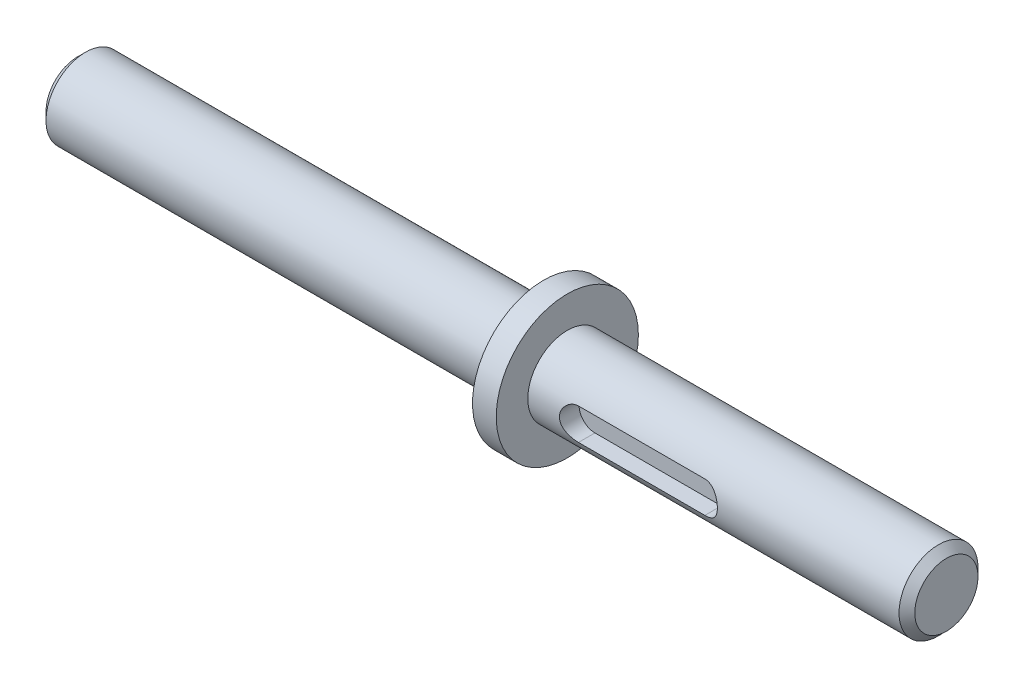
ISO-10303-21;
HEADER;
FILE_DESCRIPTION(('STEP AP214'),'2;1');
FILE_NAME('part.step','',(''),(''),'','','');
FILE_SCHEMA(('AUTOMOTIVE_DESIGN { 1 0 10303 214 1 1 1 1 }'));
ENDSEC;
DATA;
#1=APPLICATION_CONTEXT('core data for automotive mechanical design processes');
#2=APPLICATION_PROTOCOL_DEFINITION('international standard','automotive_design',2000,#1);
#3=PRODUCT_CONTEXT('',#1,'mechanical');
#4=PRODUCT('Part','Part','',(#3));
#5=PRODUCT_RELATED_PRODUCT_CATEGORY('part','',(#4));
#6=PRODUCT_DEFINITION_FORMATION('','',#4);
#7=PRODUCT_DEFINITION_CONTEXT('part definition',#1,'design');
#8=PRODUCT_DEFINITION('design','',#6,#7);
#9=PRODUCT_DEFINITION_SHAPE('','',#8);
#10=(LENGTH_UNIT() NAMED_UNIT(*) SI_UNIT(.MILLI.,.METRE.));
#11=(NAMED_UNIT(*) PLANE_ANGLE_UNIT() SI_UNIT($,.RADIAN.));
#12=(NAMED_UNIT(*) SI_UNIT($,.STERADIAN.) SOLID_ANGLE_UNIT());
#13=UNCERTAINTY_MEASURE_WITH_UNIT(LENGTH_MEASURE(1.E-05),#10,'distance_accuracy_value','');
#14=(GEOMETRIC_REPRESENTATION_CONTEXT(3) GLOBAL_UNCERTAINTY_ASSIGNED_CONTEXT((#13)) GLOBAL_UNIT_ASSIGNED_CONTEXT((#10,
#11,#12)) REPRESENTATION_CONTEXT('',''));
#15=CARTESIAN_POINT('',(0.,0.,0.));
#16=DIRECTION('',(0.,0.,1.));
#17=DIRECTION('',(1.,0.,0.));
#18=AXIS2_PLACEMENT_3D('',#15,#16,#17);
#19=CARTESIAN_POINT('',(-59.,0.,0.));
#20=DIRECTION('',(1.,0.,0.));
#21=DIRECTION('',(0.,0.,-1.));
#22=AXIS2_PLACEMENT_3D('',#19,#20,#21);
#23=PLANE('',#22);
#24=CARTESIAN_POINT('',(-59.,0.,0.));
#25=DIRECTION('',(1.,0.,0.));
#26=DIRECTION('',(0.,0.,-1.));
#27=AXIS2_PLACEMENT_3D('',#24,#25,#26);
#28=CIRCLE('',#27,4.);
#29=CARTESIAN_POINT('',(-59.,0.,-4.));
#30=VERTEX_POINT('',#29);
#31=EDGE_CURVE('E174',#30,#30,#28,.F.);
#32=ORIENTED_EDGE('',*,*,#31,.T.);
#33=EDGE_LOOP('',(#32));
#34=FACE_BOUND('',#33,.T.);
#35=ADVANCED_FACE('F32',(#34),#23,.F.);
#36=CARTESIAN_POINT('',(0.,0.,0.));
#37=DIRECTION('',(1.,0.,0.));
#38=DIRECTION('',(0.,0.,-1.));
#39=AXIS2_PLACEMENT_3D('',#36,#37,#38);
#40=CYLINDRICAL_SURFACE('',#39,5.);
#41=CARTESIAN_POINT('',(-58.,0.,0.));
#42=DIRECTION('',(1.,0.,0.));
#43=DIRECTION('',(0.,0.,-1.));
#44=AXIS2_PLACEMENT_3D('',#41,#42,#43);
#45=CIRCLE('',#44,5.);
#46=CARTESIAN_POINT('',(-58.,0.,-5.));
#47=VERTEX_POINT('',#46);
#48=EDGE_CURVE('E177',#47,#47,#45,.T.);
#49=ORIENTED_EDGE('',*,*,#48,.T.);
#50=EDGE_LOOP('',(#49));
#51=FACE_BOUND('',#50,.T.);
#52=CARTESIAN_POINT('',(0.,0.,0.));
#53=DIRECTION('',(1.,0.,0.));
#54=DIRECTION('',(0.,0.,-1.));
#55=AXIS2_PLACEMENT_3D('',#52,#53,#54);
#56=CIRCLE('',#55,5.);
#57=CARTESIAN_POINT('',(0.,0.,-5.));
#58=VERTEX_POINT('',#57);
#59=EDGE_CURVE('E112',#58,#58,#56,.T.);
#60=ORIENTED_EDGE('',*,*,#59,.F.);
#61=EDGE_LOOP('',(#60));
#62=FACE_BOUND('',#61,.T.);
#63=ADVANCED_FACE('F153',(#51,#62),#40,.T.);
#64=CARTESIAN_POINT('',(0.,0.,5.));
#65=DIRECTION('',(1.,0.,0.));
#66=DIRECTION('',(0.,0.,-1.));
#67=AXIS2_PLACEMENT_3D('',#64,#65,#66);
#68=PLANE('',#67);
#69=CARTESIAN_POINT('',(0.,0.,0.));
#70=DIRECTION('',(1.,0.,0.));
#71=DIRECTION('',(0.,0.,-1.));
#72=AXIS2_PLACEMENT_3D('',#69,#70,#71);
#73=CIRCLE('',#72,9.);
#74=CARTESIAN_POINT('',(0.,0.,-9.));
#75=VERTEX_POINT('',#74);
#76=EDGE_CURVE('E109',#75,#75,#73,.T.);
#77=ORIENTED_EDGE('',*,*,#76,.F.);
#78=EDGE_LOOP('',(#77));
#79=FACE_BOUND('',#78,.T.);
#80=ORIENTED_EDGE('',*,*,#59,.T.);
#81=EDGE_LOOP('',(#80));
#82=FACE_BOUND('',#81,.T.);
#83=ADVANCED_FACE('F159',(#79,#82),#68,.F.);
#84=CARTESIAN_POINT('',(0.,0.,0.));
#85=DIRECTION('',(1.,0.,0.));
#86=DIRECTION('',(0.,0.,-1.));
#87=AXIS2_PLACEMENT_3D('',#84,#85,#86);
#88=CYLINDRICAL_SURFACE('',#87,9.);
#89=CARTESIAN_POINT('',(3.,0.,0.));
#90=DIRECTION('',(1.,0.,0.));
#91=DIRECTION('',(0.,0.,-1.));
#92=AXIS2_PLACEMENT_3D('',#89,#90,#91);
#93=CIRCLE('',#92,9.);
#94=CARTESIAN_POINT('',(3.,0.,-9.));
#95=VERTEX_POINT('',#94);
#96=EDGE_CURVE('E106',#95,#95,#93,.T.);
#97=ORIENTED_EDGE('',*,*,#96,.F.);
#98=EDGE_LOOP('',(#97));
#99=FACE_BOUND('',#98,.T.);
#100=ORIENTED_EDGE('',*,*,#76,.T.);
#101=EDGE_LOOP('',(#100));
#102=FACE_BOUND('',#101,.T.);
#103=ADVANCED_FACE('F254',(#99,#102),#88,.T.);
#104=CARTESIAN_POINT('',(3.,0.,9.));
#105=DIRECTION('',(-1.,0.,0.));
#106=DIRECTION('',(0.,0.,1.));
#107=AXIS2_PLACEMENT_3D('',#104,#105,#106);
#108=PLANE('',#107);
#109=CARTESIAN_POINT('',(3.,0.,0.));
#110=DIRECTION('',(1.,0.,0.));
#111=DIRECTION('',(0.,0.,-1.));
#112=AXIS2_PLACEMENT_3D('',#109,#110,#111);
#113=CIRCLE('',#112,5.);
#114=CARTESIAN_POINT('',(3.,0.,-5.));
#115=VERTEX_POINT('',#114);
#116=EDGE_CURVE('E100',#115,#115,#113,.T.);
#117=ORIENTED_EDGE('',*,*,#116,.F.);
#118=EDGE_LOOP('',(#117));
#119=FACE_BOUND('',#118,.T.);
#120=ORIENTED_EDGE('',*,*,#96,.T.);
#121=EDGE_LOOP('',(#120));
#122=FACE_BOUND('',#121,.T.);
#123=ADVANCED_FACE('F149',(#119,#122),#108,.F.);
#124=CARTESIAN_POINT('',(0.,0.,0.));
#125=DIRECTION('',(1.,0.,0.));
#126=DIRECTION('',(0.,0.,-1.));
#127=AXIS2_PLACEMENT_3D('',#124,#125,#126);
#128=CYLINDRICAL_SURFACE('',#127,5.);
#129=CARTESIAN_POINT('',(50.,0.,0.));
#130=DIRECTION('',(-1.,0.,0.));
#131=DIRECTION('',(0.,0.,1.));
#132=AXIS2_PLACEMENT_3D('',#129,#130,#131);
#133=CIRCLE('',#132,5.);
#134=CARTESIAN_POINT('',(50.,0.,5.));
#135=VERTEX_POINT('',#134);
#136=EDGE_CURVE('E11',#135,#135,#133,.T.);
#137=ORIENTED_EDGE('',*,*,#136,.T.);
#138=EDGE_LOOP('',(#137));
#139=FACE_BOUND('',#138,.T.);
#140=DIRECTION('',(1.,0.,0.));
#141=VECTOR('',#140,1.);
#142=CARTESIAN_POINT('',(0.,2.,4.58257569495584));
#143=LINE('',#142,#141);
#144=CARTESIAN_POINT('',(9.,2.,4.58257569495584));
#145=VERTEX_POINT('',#144);
#146=CARTESIAN_POINT('',(25.,2.,4.58257569495584));
#147=VERTEX_POINT('',#146);
#148=EDGE_CURVE('E55',#145,#147,#143,.T.);
#149=ORIENTED_EDGE('',*,*,#148,.T.);
#150=CARTESIAN_POINT('',(25.,2.,4.58257569495584));
#151=CARTESIAN_POINT('',(25.0538058525026,2.00000798036347,4.58256464470381));
#152=CARTESIAN_POINT('',(25.1076056655576,1.99782891366025,4.58352306077323));
#153=CARTESIAN_POINT('',(25.2147712982547,1.98915905973447,4.58729625417543));
#154=CARTESIAN_POINT('',(25.268137275356,1.98266991468793,4.59011032448545));
#155=CARTESIAN_POINT('',(25.3738468215588,1.9654760367637,4.59749782920639));
#156=CARTESIAN_POINT('',(25.426193584044,1.95478796820434,4.60206430717533));
#157=CARTESIAN_POINT('',(25.5297007717145,1.92931630190661,4.61280053296682));
#158=CARTESIAN_POINT('',(25.5808611242772,1.9145324541709,4.61897037865398));
#159=CARTESIAN_POINT('',(25.731935850582,1.86426971793523,4.63959291248421));
#160=CARTESIAN_POINT('',(25.8296542306897,1.82284489460008,4.6561744915743));
#161=CARTESIAN_POINT('',(26.0167955800826,1.72548191592176,4.6931237076538));
#162=CARTESIAN_POINT('',(26.1062105529617,1.66952996336925,4.71349493864007));
#163=CARTESIAN_POINT('',(26.2792623966742,1.54131835736854,4.75700999402114));
#164=CARTESIAN_POINT('',(26.3623672169202,1.4683691399273,4.78024245635516));
#165=CARTESIAN_POINT('',(26.5155402722107,1.30969646176209,4.82612790548656));
#166=CARTESIAN_POINT('',(26.5856058308657,1.22397038499682,4.84878077249721));
#167=CARTESIAN_POINT('',(26.7134063941957,1.03800590808969,4.89203417106082));
#168=CARTESIAN_POINT('',(26.7705448092619,0.937327933050962,4.91251824543531));
#169=CARTESIAN_POINT('',(26.8668440726886,0.72682414324671,4.94803944125004));
#170=CARTESIAN_POINT('',(26.9060124240517,0.617002169026245,4.96307883544185));
#171=CARTESIAN_POINT('',(26.9633412013106,0.396967441295691,4.98538314653816));
#172=CARTESIAN_POINT('',(26.9824269509057,0.28703105452306,4.99298922547927));
#173=CARTESIAN_POINT('',(27.0020284799456,0.0652684304565164,5.00080310201086));
#174=CARTESIAN_POINT('',(27.0025508380235,-0.0465571232841641,5.0010135205303));
#175=CARTESIAN_POINT('',(26.9855171608401,-0.262233376226782,4.99421960045302));
#176=CARTESIAN_POINT('',(26.968974953326,-0.366179202506789,4.98761985585461));
#177=CARTESIAN_POINT('',(26.9200065729465,-0.569674786500928,4.96849270441446));
#178=CARTESIAN_POINT('',(26.8875795011314,-0.669224295072841,4.95596496209929));
#179=CARTESIAN_POINT('',(26.8073637035755,-0.862897539070294,4.92596830598785));
#180=CARTESIAN_POINT('',(26.7593507591895,-0.956916851366438,4.90842774755848));
#181=CARTESIAN_POINT('',(26.6495354114049,-1.13580746919776,4.87014602008043));
#182=CARTESIAN_POINT('',(26.5877281703094,-1.22067554984697,4.84940372896448));
#183=CARTESIAN_POINT('',(26.4473558197415,-1.38476339273626,4.80521782746144));
#184=CARTESIAN_POINT('',(26.36795752533,-1.46324770308939,4.78168627172885));
#185=CARTESIAN_POINT('',(26.1970199048523,-1.60609926099477,4.7356195058465));
#186=CARTESIAN_POINT('',(26.1054750779058,-1.67046007709005,4.71308475332783));
#187=CARTESIAN_POINT('',(25.9095297159788,-1.78493657933605,4.67095688856025));
#188=CARTESIAN_POINT('',(25.8048351633398,-1.83458932217622,4.65146702150583));
#189=CARTESIAN_POINT('',(25.5876384755705,-1.91521298357264,4.61886105059582));
#190=CARTESIAN_POINT('',(25.4751505526617,-1.94621696002208,4.60573367628738));
#191=CARTESIAN_POINT('',(25.301256365842,-1.9781058182572,4.59208303529493));
#192=CARTESIAN_POINT('',(25.2413424506987,-1.98630505165979,4.58853437680526));
#193=CARTESIAN_POINT('',(25.1209649810045,-1.99725282103812,4.58377540314388));
#194=CARTESIAN_POINT('',(25.0605017882422,-2.00000471568568,4.58256364711744));
#195=CARTESIAN_POINT('',(25.,-2.,4.58257569495584));
#196=B_SPLINE_CURVE_WITH_KNOTS('',3,(#150,#151,#152,#153,#154,#155,#156,#157,#158,#159,#160,
#161,#162,#163,#164,#165,#166,#167,#168,#169,#170,#171,#172,#173,#174,#175,#176,#177,#178,#179,
#180,#181,#182,#183,#184,#185,#186,#187,#188,#189,#190,#191,#192,#193,#194,#195),.UNSPECIFIED.,
.F.,.F.,(4,2,2,2,2,2,2,2,2,2,2,2,2,2,2,2,2,2,2,2,2,2,4),(0.,0.161354853098821,0.322648263883208,
0.48330791125188,0.643977367092306,0.964683001739093,1.28569434942626,1.62318047995498,
1.96073580539191,2.31162858925764,2.66237473197323,2.9961387650427,3.32978451514655,
3.64468915259535,3.95961161305654,4.27928176927546,4.59906421133019,4.93981874675152,
5.28072813203934,5.63144241548463,5.98153315592125,6.16300192557814,6.34435877193561),.UNSPECIFIED.);
#197=CARTESIAN_POINT('',(25.,-2.,4.58257569495584));
#198=VERTEX_POINT('',#197);
#199=EDGE_CURVE('E115',#147,#198,#196,.T.);
#200=ORIENTED_EDGE('',*,*,#199,.T.);
#201=DIRECTION('',(1.,0.,0.));
#202=VECTOR('',#201,1.);
#203=CARTESIAN_POINT('',(0.,-2.,4.58257569495584));
#204=LINE('',#203,#202);
#205=CARTESIAN_POINT('',(9.,-2.,4.58257569495584));
#206=VERTEX_POINT('',#205);
#207=EDGE_CURVE('E180',#198,#206,#204,.F.);
#208=ORIENTED_EDGE('',*,*,#207,.T.);
#209=CARTESIAN_POINT('',(9.,-2.,4.58257569495584));
#210=CARTESIAN_POINT('',(8.9461941474974,-2.00000798036347,4.58256464470381));
#211=CARTESIAN_POINT('',(8.89239433444235,-1.99782891366025,4.58352306077323));
#212=CARTESIAN_POINT('',(8.78522870174529,-1.98915905973447,4.58729625417543));
#213=CARTESIAN_POINT('',(8.73186272464397,-1.98266991468792,4.59011032448545));
#214=CARTESIAN_POINT('',(8.62615317844121,-1.9654760367637,4.5974978292064));
#215=CARTESIAN_POINT('',(8.57380641595597,-1.95478796820434,4.60206430717533));
#216=CARTESIAN_POINT('',(8.47029922828554,-1.9293163019066,4.61280053296682));
#217=CARTESIAN_POINT('',(8.41913887572283,-1.9145324541709,4.61897037865398));
#218=CARTESIAN_POINT('',(8.26806414941803,-1.86426971793523,4.63959291248421));
#219=CARTESIAN_POINT('',(8.17034576931025,-1.82284489460008,4.6561744915743));
#220=CARTESIAN_POINT('',(7.98320441991737,-1.72548191592176,4.6931237076538));
#221=CARTESIAN_POINT('',(7.89378944703834,-1.66952996336925,4.71349493864007));
#222=CARTESIAN_POINT('',(7.72073760332578,-1.54131835736854,4.75700999402114));
#223=CARTESIAN_POINT('',(7.63763278307977,-1.4683691399273,4.78024245635516));
#224=CARTESIAN_POINT('',(7.48445972778927,-1.30969646176209,4.82612790548656));
#225=CARTESIAN_POINT('',(7.41439416913425,-1.22397038499682,4.84878077249721));
#226=CARTESIAN_POINT('',(7.28659360580435,-1.03800590808968,4.89203417106082));
#227=CARTESIAN_POINT('',(7.22945519073807,-0.93732793305096,4.91251824543531));
#228=CARTESIAN_POINT('',(7.13315592731135,-0.726824143246708,4.94803944125004));
#229=CARTESIAN_POINT('',(7.09398757594832,-0.617002169026243,4.96307883544185));
#230=CARTESIAN_POINT('',(7.03665879868942,-0.396967441295689,4.98538314653816));
#231=CARTESIAN_POINT('',(7.01757304909434,-0.287031054523058,4.99298922547927));
#232=CARTESIAN_POINT('',(6.99797152005438,-0.0652684304565137,5.00080310201086));
#233=CARTESIAN_POINT('',(6.99744916197646,0.046557123284167,5.0010135205303));
#234=CARTESIAN_POINT('',(7.01448283915986,0.262233376226785,4.99421960045302));
#235=CARTESIAN_POINT('',(7.031025046674,0.366179202506793,4.98761985585461));
#236=CARTESIAN_POINT('',(7.07999342705354,0.569674786500931,4.96849270441446));
#237=CARTESIAN_POINT('',(7.11242049886861,0.669224295072843,4.95596496209929));
#238=CARTESIAN_POINT('',(7.19263629642451,0.862897539070296,4.92596830598785));
#239=CARTESIAN_POINT('',(7.24064924081045,0.95691685136644,4.90842774755848));
#240=CARTESIAN_POINT('',(7.35046458859515,1.13580746919776,4.87014602008043));
#241=CARTESIAN_POINT('',(7.41227182969058,1.22067554984698,4.84940372896448));
#242=CARTESIAN_POINT('',(7.55264418025852,1.38476339273627,4.80521782746144));
#243=CARTESIAN_POINT('',(7.63204247467003,1.4632477030894,4.78168627172884));
#244=CARTESIAN_POINT('',(7.80298009514766,1.60609926099478,4.7356195058465));
#245=CARTESIAN_POINT('',(7.89452492209425,1.67046007709005,4.71308475332783));
#246=CARTESIAN_POINT('',(8.09047028402121,1.78493657933605,4.67095688856025));
#247=CARTESIAN_POINT('',(8.1951648366602,1.83458932217622,4.65146702150583));
#248=CARTESIAN_POINT('',(8.41236152442947,1.91521298357264,4.61886105059582));
#249=CARTESIAN_POINT('',(8.5248494473383,1.94621696002208,4.60573367628738));
#250=CARTESIAN_POINT('',(8.69874363415798,1.9781058182572,4.59208303529493));
#251=CARTESIAN_POINT('',(8.75865754930133,1.98630505165979,4.58853437680526));
#252=CARTESIAN_POINT('',(8.87903501899553,1.99725282103812,4.58377540314389));
#253=CARTESIAN_POINT('',(8.93949821175783,2.00000471568568,4.58256364711745));
#254=CARTESIAN_POINT('',(9.,2.,4.58257569495584));
#255=B_SPLINE_CURVE_WITH_KNOTS('',3,(#209,#210,#211,#212,#213,#214,#215,#216,#217,#218,#219,
#220,#221,#222,#223,#224,#225,#226,#227,#228,#229,#230,#231,#232,#233,#234,#235,#236,#237,#238,
#239,#240,#241,#242,#243,#244,#245,#246,#247,#248,#249,#250,#251,#252,#253,#254),.UNSPECIFIED.,
.F.,.F.,(4,2,2,2,2,2,2,2,2,2,2,2,2,2,2,2,2,2,2,2,2,2,4),(0.,0.161354853098824,0.322648263883208,
0.48330791125188,0.643977367092306,0.964683001739095,1.28569434942626,1.62318047995498,
1.96073580539191,2.31162858925764,2.66237473197323,2.9961387650427,3.32978451514656,
3.64468915259535,3.95961161305654,4.27928176927546,4.59906421133019,4.93981874675153,
5.28072813203933,5.63144241548462,5.98153315592125,6.16300192557813,6.3443587719356),.UNSPECIFIED.);
#256=EDGE_CURVE('E47',#206,#145,#255,.T.);
#257=ORIENTED_EDGE('',*,*,#256,.T.);
#258=EDGE_LOOP('',(#149,#200,#208,#257));
#259=FACE_BOUND('',#258,.T.);
#260=ORIENTED_EDGE('',*,*,#116,.T.);
#261=EDGE_LOOP('',(#260));
#262=FACE_BOUND('',#261,.T.);
#263=ADVANCED_FACE('F128',(#139,#259,#262),#128,.T.);
#264=CARTESIAN_POINT('',(51.,0.,5.));
#265=DIRECTION('',(-1.,0.,0.));
#266=DIRECTION('',(0.,0.,1.));
#267=AXIS2_PLACEMENT_3D('',#264,#265,#266);
#268=PLANE('',#267);
#269=CARTESIAN_POINT('',(51.,0.,0.));
#270=DIRECTION('',(-1.,0.,0.));
#271=DIRECTION('',(0.,0.,1.));
#272=AXIS2_PLACEMENT_3D('',#269,#270,#271);
#273=CIRCLE('',#272,3.99999999999999);
#274=CARTESIAN_POINT('',(51.,0.,3.99999999999999));
#275=VERTEX_POINT('',#274);
#276=EDGE_CURVE('E40',#275,#275,#273,.F.);
#277=ORIENTED_EDGE('',*,*,#276,.T.);
#278=EDGE_LOOP('',(#277));
#279=FACE_BOUND('',#278,.T.);
#280=ADVANCED_FACE('F143',(#279),#268,.F.);
#281=CARTESIAN_POINT('',(9.,0.,2.5));
#282=DIRECTION('',(0.,0.,1.));
#283=DIRECTION('',(1.,0.,0.));
#284=AXIS2_PLACEMENT_3D('',#281,#282,#283);
#285=CYLINDRICAL_SURFACE('',#284,2.);
#286=DIRECTION('',(0.,0.,1.));
#287=VECTOR('',#286,1.);
#288=CARTESIAN_POINT('',(9.,-2.,2.5));
#289=LINE('',#288,#287);
#290=CARTESIAN_POINT('',(9.,-2.,2.5));
#291=VERTEX_POINT('',#290);
#292=EDGE_CURVE('E72',#291,#206,#289,.T.);
#293=ORIENTED_EDGE('',*,*,#292,.F.);
#294=CARTESIAN_POINT('',(9.,0.,2.5));
#295=DIRECTION('',(0.,0.,1.));
#296=DIRECTION('',(1.,0.,0.));
#297=AXIS2_PLACEMENT_3D('',#294,#295,#296);
#298=CIRCLE('',#297,2.);
#299=CARTESIAN_POINT('',(9.,2.,2.5));
#300=VERTEX_POINT('',#299);
#301=EDGE_CURVE('E76',#300,#291,#298,.T.);
#302=ORIENTED_EDGE('',*,*,#301,.F.);
#303=DIRECTION('',(0.,0.,1.));
#304=VECTOR('',#303,1.);
#305=CARTESIAN_POINT('',(9.,2.,2.5));
#306=LINE('',#305,#304);
#307=EDGE_CURVE('E98',#300,#145,#306,.T.);
#308=ORIENTED_EDGE('',*,*,#307,.T.);
#309=ORIENTED_EDGE('',*,*,#256,.F.);
#310=EDGE_LOOP('',(#293,#302,#308,#309));
#311=FACE_BOUND('',#310,.T.);
#312=ADVANCED_FACE('F74',(#311),#285,.F.);
#313=CARTESIAN_POINT('',(9.,2.,2.5));
#314=DIRECTION('',(0.,1.,0.));
#315=DIRECTION('',(0.,0.,1.));
#316=AXIS2_PLACEMENT_3D('',#313,#314,#315);
#317=PLANE('',#316);
#318=ORIENTED_EDGE('',*,*,#307,.F.);
#319=DIRECTION('',(-1.,0.,0.));
#320=VECTOR('',#319,1.);
#321=CARTESIAN_POINT('',(9.,2.,2.5));
#322=LINE('',#321,#320);
#323=CARTESIAN_POINT('',(25.,2.,2.5));
#324=VERTEX_POINT('',#323);
#325=EDGE_CURVE('E81',#324,#300,#322,.T.);
#326=ORIENTED_EDGE('',*,*,#325,.F.);
#327=DIRECTION('',(0.,0.,1.));
#328=VECTOR('',#327,1.);
#329=CARTESIAN_POINT('',(25.,2.,2.5));
#330=LINE('',#329,#328);
#331=EDGE_CURVE('E101',#324,#147,#330,.T.);
#332=ORIENTED_EDGE('',*,*,#331,.T.);
#333=ORIENTED_EDGE('',*,*,#148,.F.);
#334=EDGE_LOOP('',(#318,#326,#332,#333));
#335=FACE_BOUND('',#334,.T.);
#336=ADVANCED_FACE('F137',(#335),#317,.F.);
#337=CARTESIAN_POINT('',(25.,0.,2.5));
#338=DIRECTION('',(0.,0.,1.));
#339=DIRECTION('',(1.,0.,0.));
#340=AXIS2_PLACEMENT_3D('',#337,#338,#339);
#341=CYLINDRICAL_SURFACE('',#340,2.);
#342=ORIENTED_EDGE('',*,*,#331,.F.);
#343=CARTESIAN_POINT('',(25.,0.,2.5));
#344=DIRECTION('',(0.,0.,1.));
#345=DIRECTION('',(1.,0.,0.));
#346=AXIS2_PLACEMENT_3D('',#343,#344,#345);
#347=CIRCLE('',#346,2.);
#348=CARTESIAN_POINT('',(25.,-2.,2.5));
#349=VERTEX_POINT('',#348);
#350=EDGE_CURVE('E90',#349,#324,#347,.T.);
#351=ORIENTED_EDGE('',*,*,#350,.F.);
#352=DIRECTION('',(0.,0.,1.));
#353=VECTOR('',#352,1.);
#354=CARTESIAN_POINT('',(25.,-2.,2.5));
#355=LINE('',#354,#353);
#356=EDGE_CURVE('E80',#349,#198,#355,.T.);
#357=ORIENTED_EDGE('',*,*,#356,.T.);
#358=ORIENTED_EDGE('',*,*,#199,.F.);
#359=EDGE_LOOP('',(#342,#351,#357,#358));
#360=FACE_BOUND('',#359,.T.);
#361=ADVANCED_FACE('F132',(#360),#341,.F.);
#362=CARTESIAN_POINT('',(9.,-2.,2.5));
#363=DIRECTION('',(0.,-1.,0.));
#364=DIRECTION('',(0.,0.,-1.));
#365=AXIS2_PLACEMENT_3D('',#362,#363,#364);
#366=PLANE('',#365);
#367=ORIENTED_EDGE('',*,*,#356,.F.);
#368=DIRECTION('',(1.,0.,0.));
#369=VECTOR('',#368,1.);
#370=CARTESIAN_POINT('',(9.,-2.,2.5));
#371=LINE('',#370,#369);
#372=EDGE_CURVE('E84',#291,#349,#371,.T.);
#373=ORIENTED_EDGE('',*,*,#372,.F.);
#374=ORIENTED_EDGE('',*,*,#292,.T.);
#375=ORIENTED_EDGE('',*,*,#207,.F.);
#376=EDGE_LOOP('',(#367,#373,#374,#375));
#377=FACE_BOUND('',#376,.T.);
#378=ADVANCED_FACE('F85',(#377),#366,.F.);
#379=CARTESIAN_POINT('',(9.,0.,2.5));
#380=DIRECTION('',(0.,0.,1.));
#381=DIRECTION('',(1.,0.,0.));
#382=AXIS2_PLACEMENT_3D('',#379,#380,#381);
#383=PLANE('',#382);
#384=ORIENTED_EDGE('',*,*,#301,.T.);
#385=ORIENTED_EDGE('',*,*,#372,.T.);
#386=ORIENTED_EDGE('',*,*,#350,.T.);
#387=ORIENTED_EDGE('',*,*,#325,.T.);
#388=EDGE_LOOP('',(#384,#385,#386,#387));
#389=FACE_BOUND('',#388,.T.);
#390=ADVANCED_FACE('F92',(#389),#383,.T.);
#391=CARTESIAN_POINT('',(-58.,0.,0.));
#392=DIRECTION('',(1.,0.,0.));
#393=DIRECTION('',(0.,0.,-1.));
#394=AXIS2_PLACEMENT_3D('',#391,#392,#393);
#395=CONICAL_SURFACE('',#394,5.,0.785398163397453);
#396=ORIENTED_EDGE('',*,*,#31,.F.);
#397=EDGE_LOOP('',(#396));
#398=FACE_BOUND('',#397,.T.);
#399=ORIENTED_EDGE('',*,*,#48,.F.);
#400=EDGE_LOOP('',(#399));
#401=FACE_BOUND('',#400,.T.);
#402=ADVANCED_FACE('F164',(#398,#401),#395,.T.);
#403=CARTESIAN_POINT('',(51.,0.,0.));
#404=DIRECTION('',(-1.,0.,0.));
#405=DIRECTION('',(0.,0.,1.));
#406=AXIS2_PLACEMENT_3D('',#403,#404,#405);
#407=CONICAL_SURFACE('',#406,3.99999999999999,0.785398163397446);
#408=ORIENTED_EDGE('',*,*,#136,.F.);
#409=EDGE_LOOP('',(#408));
#410=FACE_BOUND('',#409,.T.);
#411=ORIENTED_EDGE('',*,*,#276,.F.);
#412=EDGE_LOOP('',(#411));
#413=FACE_BOUND('',#412,.T.);
#414=ADVANCED_FACE('F34',(#410,#413),#407,.T.);
#415=CLOSED_SHELL('',(#35,#63,#83,#103,#123,#263,#280,#312,#336,#361,#378,#390,#402,#414));
#416=MANIFOLD_SOLID_BREP('B2',#415);
#417=ADVANCED_BREP_SHAPE_REPRESENTATION('',(#18,#416),#14);
#418=SHAPE_DEFINITION_REPRESENTATION(#9,#417);
ENDSEC;
END-ISO-10303-21;
